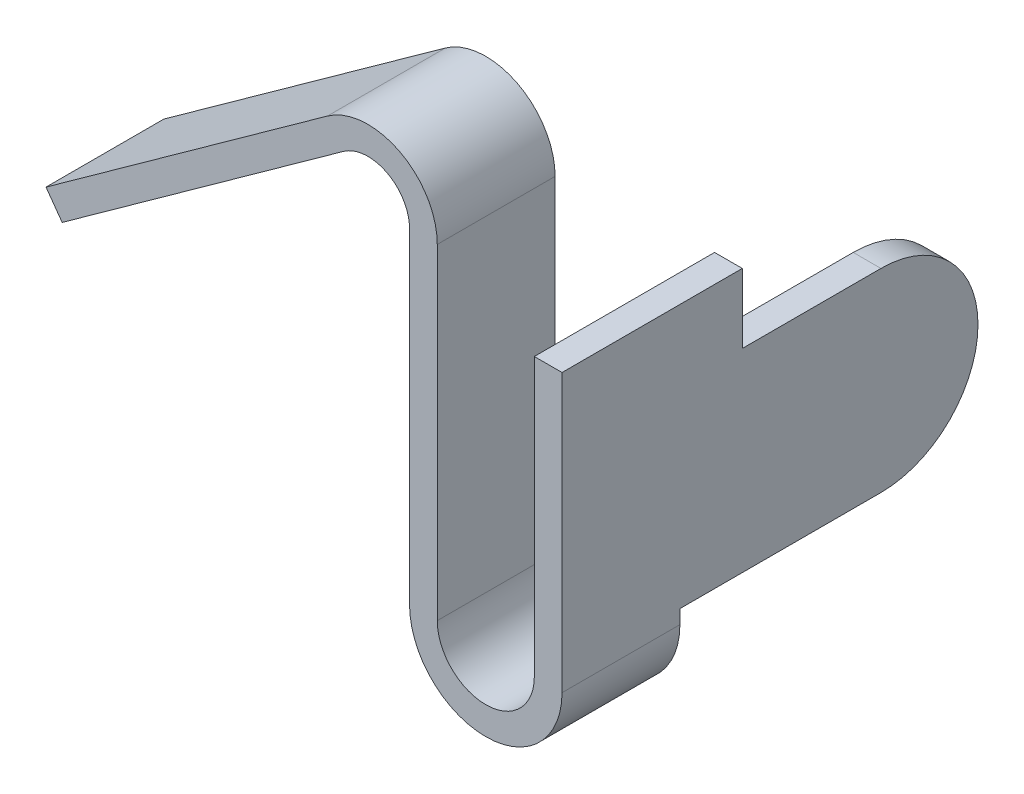
ISO-10303-21;
HEADER;
FILE_DESCRIPTION(('STEP AP214'),'2;1');
FILE_NAME('part.step','',(''),(''),'','','');
FILE_SCHEMA(('AUTOMOTIVE_DESIGN { 1 0 10303 214 1 1 1 1 }'));
ENDSEC;
DATA;
#1=APPLICATION_CONTEXT('core data for automotive mechanical design processes');
#2=APPLICATION_PROTOCOL_DEFINITION('international standard','automotive_design',2000,#1);
#3=PRODUCT_CONTEXT('',#1,'mechanical');
#4=PRODUCT('Part','Part','',(#3));
#5=PRODUCT_RELATED_PRODUCT_CATEGORY('part','',(#4));
#6=PRODUCT_DEFINITION_FORMATION('','',#4);
#7=PRODUCT_DEFINITION_CONTEXT('part definition',#1,'design');
#8=PRODUCT_DEFINITION('design','',#6,#7);
#9=PRODUCT_DEFINITION_SHAPE('','',#8);
#10=(LENGTH_UNIT() NAMED_UNIT(*) SI_UNIT(.MILLI.,.METRE.));
#11=(NAMED_UNIT(*) PLANE_ANGLE_UNIT() SI_UNIT($,.RADIAN.));
#12=(NAMED_UNIT(*) SI_UNIT($,.STERADIAN.) SOLID_ANGLE_UNIT());
#13=UNCERTAINTY_MEASURE_WITH_UNIT(LENGTH_MEASURE(1.E-05),#10,'distance_accuracy_value','');
#14=(GEOMETRIC_REPRESENTATION_CONTEXT(3) GLOBAL_UNCERTAINTY_ASSIGNED_CONTEXT((#13)) GLOBAL_UNIT_ASSIGNED_CONTEXT((#10,
#11,#12)) REPRESENTATION_CONTEXT('',''));
#15=CARTESIAN_POINT('',(0.,0.,0.));
#16=DIRECTION('',(0.,0.,1.));
#17=DIRECTION('',(1.,0.,0.));
#18=AXIS2_PLACEMENT_3D('',#15,#16,#17);
#19=CARTESIAN_POINT('',(0.,-0.7,-0.7));
#20=DIRECTION('',(0.,-1.,0.));
#21=DIRECTION('',(0.,0.,-1.));
#22=AXIS2_PLACEMENT_3D('',#19,#20,#21);
#23=PLANE('',#22);
#24=DIRECTION('',(0.,0.,1.));
#25=VECTOR('',#24,1.);
#26=CARTESIAN_POINT('',(2.7,-0.7,-0.7));
#27=LINE('',#26,#25);
#28=CARTESIAN_POINT('',(2.7,-0.7,-1.7));
#29=VERTEX_POINT('',#28);
#30=CARTESIAN_POINT('',(2.7,-0.7,-0.25));
#31=VERTEX_POINT('',#30);
#32=EDGE_CURVE('E221',#29,#31,#27,.T.);
#33=ORIENTED_EDGE('',*,*,#32,.T.);
#34=DIRECTION('',(1.,0.,0.));
#35=VECTOR('',#34,1.);
#36=CARTESIAN_POINT('',(0.,-0.7,-0.25));
#37=LINE('',#36,#35);
#38=CARTESIAN_POINT('',(2.5,-0.7,-0.25));
#39=VERTEX_POINT('',#38);
#40=EDGE_CURVE('E183',#39,#31,#37,.T.);
#41=ORIENTED_EDGE('',*,*,#40,.F.);
#42=DIRECTION('',(0.,0.,1.));
#43=VECTOR('',#42,1.);
#44=CARTESIAN_POINT('',(2.5,-0.7,-0.7));
#45=LINE('',#44,#43);
#46=CARTESIAN_POINT('',(2.5,-0.7,-1.7));
#47=VERTEX_POINT('',#46);
#48=EDGE_CURVE('E220',#47,#39,#45,.T.);
#49=ORIENTED_EDGE('',*,*,#48,.F.);
#50=DIRECTION('',(1.,0.,0.));
#51=VECTOR('',#50,1.);
#52=CARTESIAN_POINT('',(2.7,-0.7,-1.7));
#53=LINE('',#52,#51);
#54=EDGE_CURVE('E11',#47,#29,#53,.T.);
#55=ORIENTED_EDGE('',*,*,#54,.T.);
#56=EDGE_LOOP('',(#33,#41,#49,#55));
#57=FACE_BOUND('',#56,.T.);
#58=ADVANCED_FACE('F34',(#57),#23,.T.);
#59=CARTESIAN_POINT('',(0.,0.,-0.7));
#60=DIRECTION('',(0.,0.,1.));
#61=DIRECTION('',(1.,0.,0.));
#62=AXIS2_PLACEMENT_3D('',#59,#60,#61);
#63=PLANE('',#62);
#64=DIRECTION('',(1.,0.,0.));
#65=VECTOR('',#64,1.);
#66=CARTESIAN_POINT('',(0.,0.7,-0.7));
#67=LINE('',#66,#65);
#68=CARTESIAN_POINT('',(2.5,0.7,-0.7));
#69=VERTEX_POINT('',#68);
#70=CARTESIAN_POINT('',(2.7,0.7,-0.7));
#71=VERTEX_POINT('',#70);
#72=EDGE_CURVE('E205',#69,#71,#67,.T.);
#73=ORIENTED_EDGE('',*,*,#72,.F.);
#74=DIRECTION('',(0.,1.,0.));
#75=VECTOR('',#74,1.);
#76=CARTESIAN_POINT('',(2.5,0.,-0.7));
#77=LINE('',#76,#75);
#78=CARTESIAN_POINT('',(2.5,1.2,-0.7));
#79=VERTEX_POINT('',#78);
#80=EDGE_CURVE('E212',#69,#79,#77,.T.);
#81=ORIENTED_EDGE('',*,*,#80,.T.);
#82=DIRECTION('',(1.,0.,0.));
#83=VECTOR('',#82,1.);
#84=CARTESIAN_POINT('',(0.,1.2,-0.7));
#85=LINE('',#84,#83);
#86=CARTESIAN_POINT('',(2.7,1.2,-0.7));
#87=VERTEX_POINT('',#86);
#88=EDGE_CURVE('E217',#79,#87,#85,.T.);
#89=ORIENTED_EDGE('',*,*,#88,.T.);
#90=DIRECTION('',(0.,-1.,0.));
#91=VECTOR('',#90,1.);
#92=CARTESIAN_POINT('',(2.7,0.,-0.7));
#93=LINE('',#92,#91);
#94=EDGE_CURVE('E214',#87,#71,#93,.T.);
#95=ORIENTED_EDGE('',*,*,#94,.T.);
#96=EDGE_LOOP('',(#73,#81,#89,#95));
#97=FACE_BOUND('',#96,.T.);
#98=ADVANCED_FACE('F303',(#97),#63,.F.);
#99=CARTESIAN_POINT('',(1.6,0.,0.6));
#100=DIRECTION('',(1.,0.,0.));
#101=DIRECTION('',(0.,0.,-1.));
#102=AXIS2_PLACEMENT_3D('',#99,#100,#101);
#103=PLANE('',#102);
#104=DIRECTION('',(0.,0.,-1.));
#105=VECTOR('',#104,1.);
#106=CARTESIAN_POINT('',(1.6,1.55,0.6));
#107=LINE('',#106,#105);
#108=CARTESIAN_POINT('',(1.6,1.55,0.6));
#109=VERTEX_POINT('',#108);
#110=CARTESIAN_POINT('',(1.6,1.55,-0.25));
#111=VERTEX_POINT('',#110);
#112=EDGE_CURVE('E179',#109,#111,#107,.T.);
#113=ORIENTED_EDGE('',*,*,#112,.T.);
#114=DIRECTION('',(0.,-1.,0.));
#115=VECTOR('',#114,1.);
#116=CARTESIAN_POINT('',(1.6,0.,-0.25));
#117=LINE('',#116,#115);
#118=CARTESIAN_POINT('',(1.6,-0.8,-0.25));
#119=VERTEX_POINT('',#118);
#120=EDGE_CURVE('E172',#111,#119,#117,.T.);
#121=ORIENTED_EDGE('',*,*,#120,.T.);
#122=DIRECTION('',(0.,0.,-1.));
#123=VECTOR('',#122,1.);
#124=CARTESIAN_POINT('',(1.6,-0.8,0.6));
#125=LINE('',#124,#123);
#126=CARTESIAN_POINT('',(1.6,-0.8,0.6));
#127=VERTEX_POINT('',#126);
#128=EDGE_CURVE('E155',#127,#119,#125,.T.);
#129=ORIENTED_EDGE('',*,*,#128,.F.);
#130=DIRECTION('',(0.,-1.,0.));
#131=VECTOR('',#130,1.);
#132=CARTESIAN_POINT('',(1.6,0.,0.6));
#133=LINE('',#132,#131);
#134=EDGE_CURVE('E224',#109,#127,#133,.T.);
#135=ORIENTED_EDGE('',*,*,#134,.F.);
#136=EDGE_LOOP('',(#113,#121,#129,#135));
#137=FACE_BOUND('',#136,.T.);
#138=ADVANCED_FACE('F177',(#137),#103,.F.);
#139=CARTESIAN_POINT('',(2.15,-0.8,0.6));
#140=DIRECTION('',(0.,0.,-1.));
#141=DIRECTION('',(-1.,0.,0.));
#142=AXIS2_PLACEMENT_3D('',#139,#140,#141);
#143=CYLINDRICAL_SURFACE('',#142,0.55);
#144=ORIENTED_EDGE('',*,*,#128,.T.);
#145=CARTESIAN_POINT('',(2.15,-0.8,-0.25));
#146=DIRECTION('',(0.,0.,1.));
#147=DIRECTION('',(1.,0.,0.));
#148=AXIS2_PLACEMENT_3D('',#145,#146,#147);
#149=CIRCLE('',#148,0.55);
#150=CARTESIAN_POINT('',(2.7,-0.8,-0.25));
#151=VERTEX_POINT('',#150);
#152=EDGE_CURVE('E159',#119,#151,#149,.T.);
#153=ORIENTED_EDGE('',*,*,#152,.T.);
#154=DIRECTION('',(0.,0.,-1.));
#155=VECTOR('',#154,1.);
#156=CARTESIAN_POINT('',(2.7,-0.8,0.6));
#157=LINE('',#156,#155);
#158=CARTESIAN_POINT('',(2.7,-0.8,0.6));
#159=VERTEX_POINT('',#158);
#160=EDGE_CURVE('E166',#159,#151,#157,.T.);
#161=ORIENTED_EDGE('',*,*,#160,.F.);
#162=CARTESIAN_POINT('',(2.15,-0.8,0.6));
#163=DIRECTION('',(0.,0.,1.));
#164=DIRECTION('',(1.,0.,0.));
#165=AXIS2_PLACEMENT_3D('',#162,#163,#164);
#166=CIRCLE('',#165,0.55);
#167=EDGE_CURVE('E160',#127,#159,#166,.T.);
#168=ORIENTED_EDGE('',*,*,#167,.F.);
#169=EDGE_LOOP('',(#144,#153,#161,#168));
#170=FACE_BOUND('',#169,.T.);
#171=ADVANCED_FACE('F157',(#170),#143,.T.);
#172=CARTESIAN_POINT('',(2.7,0.,0.6));
#173=DIRECTION('',(-1.,0.,0.));
#174=DIRECTION('',(0.,-1.,0.));
#175=AXIS2_PLACEMENT_3D('',#172,#173,#174);
#176=PLANE('',#175);
#177=CARTESIAN_POINT('',(2.7,0.,-1.7));
#178=DIRECTION('',(-1.,0.,0.));
#179=DIRECTION('',(0.,-1.,0.));
#180=AXIS2_PLACEMENT_3D('',#177,#178,#179);
#181=CIRCLE('',#180,0.7);
#182=CARTESIAN_POINT('',(2.7,0.,-2.4));
#183=VERTEX_POINT('',#182);
#184=EDGE_CURVE('E165',#29,#183,#181,.F.);
#185=ORIENTED_EDGE('',*,*,#184,.T.);
#186=CARTESIAN_POINT('',(2.7,0.,-1.7));
#187=DIRECTION('',(-1.,0.,0.));
#188=DIRECTION('',(0.,-1.,0.));
#189=AXIS2_PLACEMENT_3D('',#186,#187,#188);
#190=CIRCLE('',#189,0.7);
#191=CARTESIAN_POINT('',(2.7,0.7,-1.7));
#192=VERTEX_POINT('',#191);
#193=EDGE_CURVE('E276',#183,#192,#190,.F.);
#194=ORIENTED_EDGE('',*,*,#193,.T.);
#195=DIRECTION('',(0.,0.,1.));
#196=VECTOR('',#195,1.);
#197=CARTESIAN_POINT('',(2.7,0.7,-2.4));
#198=LINE('',#197,#196);
#199=EDGE_CURVE('E208',#192,#71,#198,.T.);
#200=ORIENTED_EDGE('',*,*,#199,.T.);
#201=ORIENTED_EDGE('',*,*,#94,.F.);
#202=DIRECTION('',(0.,0.,-1.));
#203=VECTOR('',#202,1.);
#204=CARTESIAN_POINT('',(2.7,1.2,0.6));
#205=LINE('',#204,#203);
#206=CARTESIAN_POINT('',(2.7,1.2,0.6));
#207=VERTEX_POINT('',#206);
#208=EDGE_CURVE('E272',#207,#87,#205,.T.);
#209=ORIENTED_EDGE('',*,*,#208,.F.);
#210=DIRECTION('',(0.,1.,0.));
#211=VECTOR('',#210,1.);
#212=CARTESIAN_POINT('',(2.7,0.,0.6));
#213=LINE('',#212,#211);
#214=EDGE_CURVE('E228',#159,#207,#213,.T.);
#215=ORIENTED_EDGE('',*,*,#214,.F.);
#216=ORIENTED_EDGE('',*,*,#160,.T.);
#217=DIRECTION('',(0.,1.,0.));
#218=VECTOR('',#217,1.);
#219=CARTESIAN_POINT('',(2.7,0.,-0.25));
#220=LINE('',#219,#218);
#221=EDGE_CURVE('E175',#151,#31,#220,.T.);
#222=ORIENTED_EDGE('',*,*,#221,.T.);
#223=ORIENTED_EDGE('',*,*,#32,.F.);
#224=EDGE_LOOP('',(#185,#194,#200,#201,#209,#215,#216,#222,#223));
#225=FACE_BOUND('',#224,.T.);
#226=ADVANCED_FACE('F296',(#225),#176,.F.);
#227=CARTESIAN_POINT('',(0.,1.2,0.6));
#228=DIRECTION('',(0.,1.,0.));
#229=DIRECTION('',(0.,0.,1.));
#230=AXIS2_PLACEMENT_3D('',#227,#228,#229);
#231=PLANE('',#230);
#232=ORIENTED_EDGE('',*,*,#208,.T.);
#233=ORIENTED_EDGE('',*,*,#88,.F.);
#234=DIRECTION('',(0.,0.,-1.));
#235=VECTOR('',#234,1.);
#236=CARTESIAN_POINT('',(2.5,1.2,0.6));
#237=LINE('',#236,#235);
#238=CARTESIAN_POINT('',(2.5,1.2,0.6));
#239=VERTEX_POINT('',#238);
#240=EDGE_CURVE('E269',#239,#79,#237,.T.);
#241=ORIENTED_EDGE('',*,*,#240,.F.);
#242=DIRECTION('',(1.,0.,0.));
#243=VECTOR('',#242,1.);
#244=CARTESIAN_POINT('',(0.,1.2,0.6));
#245=LINE('',#244,#243);
#246=EDGE_CURVE('E230',#239,#207,#245,.T.);
#247=ORIENTED_EDGE('',*,*,#246,.T.);
#248=EDGE_LOOP('',(#232,#233,#241,#247));
#249=FACE_BOUND('',#248,.T.);
#250=ADVANCED_FACE('F308',(#249),#231,.T.);
#251=CARTESIAN_POINT('',(2.5,0.,0.6));
#252=DIRECTION('',(-1.,0.,0.));
#253=DIRECTION('',(0.,0.,1.));
#254=AXIS2_PLACEMENT_3D('',#251,#252,#253);
#255=PLANE('',#254);
#256=DIRECTION('',(0.,0.,1.));
#257=VECTOR('',#256,1.);
#258=CARTESIAN_POINT('',(2.5,0.7,-2.4));
#259=LINE('',#258,#257);
#260=CARTESIAN_POINT('',(2.5,0.7,-1.7));
#261=VERTEX_POINT('',#260);
#262=EDGE_CURVE('E210',#261,#69,#259,.T.);
#263=ORIENTED_EDGE('',*,*,#262,.F.);
#264=CARTESIAN_POINT('',(2.5,0.,-1.7));
#265=DIRECTION('',(-1.,0.,0.));
#266=DIRECTION('',(0.,0.,1.));
#267=AXIS2_PLACEMENT_3D('',#264,#265,#266);
#268=CIRCLE('',#267,0.7);
#269=CARTESIAN_POINT('',(2.5,0.,-2.4));
#270=VERTEX_POINT('',#269);
#271=EDGE_CURVE('E43',#261,#270,#268,.T.);
#272=ORIENTED_EDGE('',*,*,#271,.T.);
#273=CARTESIAN_POINT('',(2.5,0.,-1.7));
#274=DIRECTION('',(-1.,0.,0.));
#275=DIRECTION('',(0.,0.,1.));
#276=AXIS2_PLACEMENT_3D('',#273,#274,#275);
#277=CIRCLE('',#276,0.7);
#278=EDGE_CURVE('E58',#270,#47,#277,.T.);
#279=ORIENTED_EDGE('',*,*,#278,.T.);
#280=ORIENTED_EDGE('',*,*,#48,.T.);
#281=DIRECTION('',(0.,1.,0.));
#282=VECTOR('',#281,1.);
#283=CARTESIAN_POINT('',(2.5,0.,-0.25));
#284=LINE('',#283,#282);
#285=CARTESIAN_POINT('',(2.5,-0.8,-0.25));
#286=VERTEX_POINT('',#285);
#287=EDGE_CURVE('E50',#286,#39,#284,.T.);
#288=ORIENTED_EDGE('',*,*,#287,.F.);
#289=DIRECTION('',(0.,0.,-1.));
#290=VECTOR('',#289,1.);
#291=CARTESIAN_POINT('',(2.5,-0.8,0.6));
#292=LINE('',#291,#290);
#293=CARTESIAN_POINT('',(2.5,-0.8,0.6));
#294=VERTEX_POINT('',#293);
#295=EDGE_CURVE('E267',#294,#286,#292,.T.);
#296=ORIENTED_EDGE('',*,*,#295,.F.);
#297=DIRECTION('',(0.,1.,0.));
#298=VECTOR('',#297,1.);
#299=CARTESIAN_POINT('',(2.5,0.,0.6));
#300=LINE('',#299,#298);
#301=EDGE_CURVE('E233',#294,#239,#300,.T.);
#302=ORIENTED_EDGE('',*,*,#301,.T.);
#303=ORIENTED_EDGE('',*,*,#240,.T.);
#304=ORIENTED_EDGE('',*,*,#80,.F.);
#305=EDGE_LOOP('',(#263,#272,#279,#280,#288,#296,#302,#303,#304));
#306=FACE_BOUND('',#305,.T.);
#307=ADVANCED_FACE('F283',(#306),#255,.T.);
#308=CARTESIAN_POINT('',(2.15,-0.8,0.6));
#309=DIRECTION('',(0.,0.,-1.));
#310=DIRECTION('',(-1.,0.,0.));
#311=AXIS2_PLACEMENT_3D('',#308,#309,#310);
#312=CYLINDRICAL_SURFACE('',#311,0.35);
#313=ORIENTED_EDGE('',*,*,#295,.T.);
#314=CARTESIAN_POINT('',(2.15,-0.8,-0.25));
#315=DIRECTION('',(0.,0.,1.));
#316=DIRECTION('',(1.,0.,0.));
#317=AXIS2_PLACEMENT_3D('',#314,#315,#316);
#318=CIRCLE('',#317,0.35);
#319=CARTESIAN_POINT('',(1.8,-0.8,-0.25));
#320=VERTEX_POINT('',#319);
#321=EDGE_CURVE('E186',#320,#286,#318,.T.);
#322=ORIENTED_EDGE('',*,*,#321,.F.);
#323=DIRECTION('',(0.,0.,-1.));
#324=VECTOR('',#323,1.);
#325=CARTESIAN_POINT('',(1.8,-0.8,0.6));
#326=LINE('',#325,#324);
#327=CARTESIAN_POINT('',(1.8,-0.8,0.6));
#328=VERTEX_POINT('',#327);
#329=EDGE_CURVE('E265',#328,#320,#326,.T.);
#330=ORIENTED_EDGE('',*,*,#329,.F.);
#331=CARTESIAN_POINT('',(2.15,-0.8,0.6));
#332=DIRECTION('',(0.,0.,1.));
#333=DIRECTION('',(1.,0.,0.));
#334=AXIS2_PLACEMENT_3D('',#331,#332,#333);
#335=CIRCLE('',#334,0.35);
#336=EDGE_CURVE('E236',#328,#294,#335,.T.);
#337=ORIENTED_EDGE('',*,*,#336,.T.);
#338=EDGE_LOOP('',(#313,#322,#330,#337));
#339=FACE_BOUND('',#338,.T.);
#340=ADVANCED_FACE('F317',(#339),#312,.F.);
#341=CARTESIAN_POINT('',(1.8,0.,0.6));
#342=DIRECTION('',(1.,0.,0.));
#343=DIRECTION('',(0.,1.,0.));
#344=AXIS2_PLACEMENT_3D('',#341,#342,#343);
#345=PLANE('',#344);
#346=ORIENTED_EDGE('',*,*,#329,.T.);
#347=DIRECTION('',(0.,-1.,0.));
#348=VECTOR('',#347,1.);
#349=CARTESIAN_POINT('',(1.8,0.,-0.25));
#350=LINE('',#349,#348);
#351=CARTESIAN_POINT('',(1.8,1.55,-0.25));
#352=VERTEX_POINT('',#351);
#353=EDGE_CURVE('E188',#352,#320,#350,.T.);
#354=ORIENTED_EDGE('',*,*,#353,.F.);
#355=DIRECTION('',(0.,0.,-1.));
#356=VECTOR('',#355,1.);
#357=CARTESIAN_POINT('',(1.8,1.55,0.6));
#358=LINE('',#357,#356);
#359=CARTESIAN_POINT('',(1.8,1.55,0.6));
#360=VERTEX_POINT('',#359);
#361=EDGE_CURVE('E263',#360,#352,#358,.T.);
#362=ORIENTED_EDGE('',*,*,#361,.F.);
#363=DIRECTION('',(0.,-1.,0.));
#364=VECTOR('',#363,1.);
#365=CARTESIAN_POINT('',(1.8,0.,0.6));
#366=LINE('',#365,#364);
#367=EDGE_CURVE('E239',#360,#328,#366,.T.);
#368=ORIENTED_EDGE('',*,*,#367,.T.);
#369=EDGE_LOOP('',(#346,#354,#362,#368));
#370=FACE_BOUND('',#369,.T.);
#371=ADVANCED_FACE('F321',(#370),#345,.T.);
#372=CARTESIAN_POINT('',(1.3,1.55,0.6));
#373=DIRECTION('',(0.,0.,-1.));
#374=DIRECTION('',(-1.,0.,0.));
#375=AXIS2_PLACEMENT_3D('',#372,#373,#374);
#376=CYLINDRICAL_SURFACE('',#375,0.5);
#377=ORIENTED_EDGE('',*,*,#361,.T.);
#378=CARTESIAN_POINT('',(1.3,1.55,-0.25));
#379=DIRECTION('',(0.,0.,1.));
#380=DIRECTION('',(1.,0.,0.));
#381=AXIS2_PLACEMENT_3D('',#378,#379,#380);
#382=CIRCLE('',#381,0.5);
#383=CARTESIAN_POINT('',(1.00820331747019,1.95602302405726,-0.25));
#384=VERTEX_POINT('',#383);
#385=EDGE_CURVE('E191',#384,#352,#382,.F.);
#386=ORIENTED_EDGE('',*,*,#385,.F.);
#387=DIRECTION('',(0.,0.,-1.));
#388=VECTOR('',#387,1.);
#389=CARTESIAN_POINT('',(1.00820331747019,1.95602302405726,0.6));
#390=LINE('',#389,#388);
#391=CARTESIAN_POINT('',(1.00820331747019,1.95602302405726,0.6));
#392=VERTEX_POINT('',#391);
#393=EDGE_CURVE('E261',#392,#384,#390,.T.);
#394=ORIENTED_EDGE('',*,*,#393,.F.);
#395=CARTESIAN_POINT('',(1.3,1.55,0.6));
#396=DIRECTION('',(0.,0.,1.));
#397=DIRECTION('',(1.,0.,0.));
#398=AXIS2_PLACEMENT_3D('',#395,#396,#397);
#399=CIRCLE('',#398,0.5);
#400=EDGE_CURVE('E242',#392,#360,#399,.F.);
#401=ORIENTED_EDGE('',*,*,#400,.T.);
#402=EDGE_LOOP('',(#377,#386,#394,#401));
#403=FACE_BOUND('',#402,.T.);
#404=ADVANCED_FACE('F326',(#403),#376,.T.);
#405=CARTESIAN_POINT('',(-0.583593365059612,0.812046048114513,0.6));
#406=DIRECTION('',(-0.583593365059612,0.812046048114513,0.));
#407=DIRECTION('',(-0.812046048114513,-0.583593365059612,0.));
#408=AXIS2_PLACEMENT_3D('',#405,#406,#407);
#409=PLANE('',#408);
#410=ORIENTED_EDGE('',*,*,#393,.T.);
#411=DIRECTION('',(0.812046048114513,0.583593365059612,0.));
#412=VECTOR('',#411,1.);
#413=CARTESIAN_POINT('',(-0.583593365059612,0.812046048114513,-0.25));
#414=LINE('',#413,#412);
#415=CARTESIAN_POINT('',(-1.02191180281609,0.497039611408226,-0.25));
#416=VERTEX_POINT('',#415);
#417=EDGE_CURVE('E194',#416,#384,#414,.T.);
#418=ORIENTED_EDGE('',*,*,#417,.F.);
#419=DIRECTION('',(0.,0.,-1.));
#420=VECTOR('',#419,1.);
#421=CARTESIAN_POINT('',(-1.02191180281609,0.497039611408226,0.6));
#422=LINE('',#421,#420);
#423=CARTESIAN_POINT('',(-1.02191180281609,0.497039611408226,0.6));
#424=VERTEX_POINT('',#423);
#425=EDGE_CURVE('E259',#424,#416,#422,.T.);
#426=ORIENTED_EDGE('',*,*,#425,.F.);
#427=DIRECTION('',(0.812046048114513,0.583593365059612,0.));
#428=VECTOR('',#427,1.);
#429=CARTESIAN_POINT('',(-0.583593365059612,0.812046048114513,0.6));
#430=LINE('',#429,#428);
#431=EDGE_CURVE('E245',#424,#392,#430,.T.);
#432=ORIENTED_EDGE('',*,*,#431,.T.);
#433=EDGE_LOOP('',(#410,#418,#426,#432));
#434=FACE_BOUND('',#433,.T.);
#435=ADVANCED_FACE('F329',(#434),#409,.T.);
#436=CARTESIAN_POINT('',(-0.438318437756473,-0.315006436706286,0.6));
#437=DIRECTION('',(0.812046048114511,0.583593365059615,0.));
#438=DIRECTION('',(-0.583593365059615,0.812046048114511,0.));
#439=AXIS2_PLACEMENT_3D('',#436,#437,#438);
#440=PLANE('',#439);
#441=ORIENTED_EDGE('',*,*,#425,.T.);
#442=DIRECTION('',(0.583593365059615,-0.812046048114511,0.));
#443=VECTOR('',#442,1.);
#444=CARTESIAN_POINT('',(-0.438318437756473,-0.315006436706286,-0.25));
#445=LINE('',#444,#443);
#446=CARTESIAN_POINT('',(-0.905193129804166,0.334630401785324,-0.25));
#447=VERTEX_POINT('',#446);
#448=EDGE_CURVE('E197',#416,#447,#445,.T.);
#449=ORIENTED_EDGE('',*,*,#448,.T.);
#450=DIRECTION('',(0.,0.,-1.));
#451=VECTOR('',#450,1.);
#452=CARTESIAN_POINT('',(-0.905193129804166,0.334630401785324,0.6));
#453=LINE('',#452,#451);
#454=CARTESIAN_POINT('',(-0.905193129804166,0.334630401785324,0.6));
#455=VERTEX_POINT('',#454);
#456=EDGE_CURVE('E257',#455,#447,#453,.T.);
#457=ORIENTED_EDGE('',*,*,#456,.F.);
#458=DIRECTION('',(0.583593365059615,-0.812046048114511,0.));
#459=VECTOR('',#458,1.);
#460=CARTESIAN_POINT('',(-0.438318437756473,-0.315006436706286,0.6));
#461=LINE('',#460,#459);
#462=EDGE_CURVE('E248',#424,#455,#461,.T.);
#463=ORIENTED_EDGE('',*,*,#462,.F.);
#464=EDGE_LOOP('',(#441,#449,#457,#463));
#465=FACE_BOUND('',#464,.T.);
#466=ADVANCED_FACE('F334',(#465),#440,.F.);
#467=CARTESIAN_POINT('',(-0.46687469204769,0.649636838491611,0.6));
#468=DIRECTION('',(-0.583593365059612,0.812046048114513,0.));
#469=DIRECTION('',(-0.812046048114513,-0.583593365059612,0.));
#470=AXIS2_PLACEMENT_3D('',#467,#468,#469);
#471=PLANE('',#470);
#472=ORIENTED_EDGE('',*,*,#456,.T.);
#473=DIRECTION('',(0.812046048114513,0.583593365059612,0.));
#474=VECTOR('',#473,1.);
#475=CARTESIAN_POINT('',(-0.46687469204769,0.649636838491611,-0.25));
#476=LINE('',#475,#474);
#477=CARTESIAN_POINT('',(1.12492199048212,1.79361381443435,-0.25));
#478=VERTEX_POINT('',#477);
#479=EDGE_CURVE('E200',#447,#478,#476,.T.);
#480=ORIENTED_EDGE('',*,*,#479,.T.);
#481=DIRECTION('',(0.,0.,-1.));
#482=VECTOR('',#481,1.);
#483=CARTESIAN_POINT('',(1.12492199048212,1.79361381443435,0.6));
#484=LINE('',#483,#482);
#485=CARTESIAN_POINT('',(1.12492199048212,1.79361381443435,0.6));
#486=VERTEX_POINT('',#485);
#487=EDGE_CURVE('E255',#486,#478,#484,.T.);
#488=ORIENTED_EDGE('',*,*,#487,.F.);
#489=DIRECTION('',(0.812046048114513,0.583593365059612,0.));
#490=VECTOR('',#489,1.);
#491=CARTESIAN_POINT('',(-0.46687469204769,0.649636838491611,0.6));
#492=LINE('',#491,#490);
#493=EDGE_CURVE('E250',#455,#486,#492,.T.);
#494=ORIENTED_EDGE('',*,*,#493,.F.);
#495=EDGE_LOOP('',(#472,#480,#488,#494));
#496=FACE_BOUND('',#495,.T.);
#497=ADVANCED_FACE('F340',(#496),#471,.F.);
#498=CARTESIAN_POINT('',(1.3,1.55,0.6));
#499=DIRECTION('',(0.,0.,-1.));
#500=DIRECTION('',(-1.,0.,0.));
#501=AXIS2_PLACEMENT_3D('',#498,#499,#500);
#502=CYLINDRICAL_SURFACE('',#501,0.3);
#503=ORIENTED_EDGE('',*,*,#487,.T.);
#504=CARTESIAN_POINT('',(1.3,1.55,-0.25));
#505=DIRECTION('',(0.,0.,1.));
#506=DIRECTION('',(1.,0.,0.));
#507=AXIS2_PLACEMENT_3D('',#504,#505,#506);
#508=CIRCLE('',#507,0.3);
#509=EDGE_CURVE('E203',#478,#111,#508,.F.);
#510=ORIENTED_EDGE('',*,*,#509,.T.);
#511=ORIENTED_EDGE('',*,*,#112,.F.);
#512=CARTESIAN_POINT('',(1.3,1.55,0.6));
#513=DIRECTION('',(0.,0.,1.));
#514=DIRECTION('',(1.,0.,0.));
#515=AXIS2_PLACEMENT_3D('',#512,#513,#514);
#516=CIRCLE('',#515,0.3);
#517=EDGE_CURVE('E252',#486,#109,#516,.F.);
#518=ORIENTED_EDGE('',*,*,#517,.F.);
#519=EDGE_LOOP('',(#503,#510,#511,#518));
#520=FACE_BOUND('',#519,.T.);
#521=ADVANCED_FACE('F342',(#520),#502,.F.);
#522=CARTESIAN_POINT('',(0.,0.,0.6));
#523=DIRECTION('',(0.,0.,1.));
#524=DIRECTION('',(1.,0.,0.));
#525=AXIS2_PLACEMENT_3D('',#522,#523,#524);
#526=PLANE('',#525);
#527=ORIENTED_EDGE('',*,*,#134,.T.);
#528=ORIENTED_EDGE('',*,*,#167,.T.);
#529=ORIENTED_EDGE('',*,*,#214,.T.);
#530=ORIENTED_EDGE('',*,*,#246,.F.);
#531=ORIENTED_EDGE('',*,*,#301,.F.);
#532=ORIENTED_EDGE('',*,*,#336,.F.);
#533=ORIENTED_EDGE('',*,*,#367,.F.);
#534=ORIENTED_EDGE('',*,*,#400,.F.);
#535=ORIENTED_EDGE('',*,*,#431,.F.);
#536=ORIENTED_EDGE('',*,*,#462,.T.);
#537=ORIENTED_EDGE('',*,*,#493,.T.);
#538=ORIENTED_EDGE('',*,*,#517,.T.);
#539=EDGE_LOOP('',(#527,#528,#529,#530,#531,#532,#533,#534,#535,#536,#537,#538));
#540=FACE_BOUND('',#539,.T.);
#541=ADVANCED_FACE('F312',(#540),#526,.T.);
#542=CARTESIAN_POINT('',(0.,0.7,-2.4));
#543=DIRECTION('',(0.,-1.,0.));
#544=DIRECTION('',(0.,0.,-1.));
#545=AXIS2_PLACEMENT_3D('',#542,#543,#544);
#546=PLANE('',#545);
#547=ORIENTED_EDGE('',*,*,#199,.F.);
#548=DIRECTION('',(1.,0.,0.));
#549=VECTOR('',#548,1.);
#550=CARTESIAN_POINT('',(0.,0.7,-1.7));
#551=LINE('',#550,#549);
#552=EDGE_CURVE('E278',#192,#261,#551,.F.);
#553=ORIENTED_EDGE('',*,*,#552,.T.);
#554=ORIENTED_EDGE('',*,*,#262,.T.);
#555=ORIENTED_EDGE('',*,*,#72,.T.);
#556=EDGE_LOOP('',(#547,#553,#554,#555));
#557=FACE_BOUND('',#556,.T.);
#558=ADVANCED_FACE('F300',(#557),#546,.F.);
#559=CARTESIAN_POINT('',(0.,0.,-1.7));
#560=DIRECTION('',(-1.,0.,0.));
#561=DIRECTION('',(0.,0.,1.));
#562=AXIS2_PLACEMENT_3D('',#559,#560,#561);
#563=CYLINDRICAL_SURFACE('',#562,0.7);
#564=ORIENTED_EDGE('',*,*,#54,.F.);
#565=ORIENTED_EDGE('',*,*,#278,.F.);
#566=DIRECTION('',(1.,0.,0.));
#567=VECTOR('',#566,1.);
#568=CARTESIAN_POINT('',(2.5,0.,-2.4));
#569=LINE('',#568,#567);
#570=EDGE_CURVE('E38',#183,#270,#569,.F.);
#571=ORIENTED_EDGE('',*,*,#570,.F.);
#572=ORIENTED_EDGE('',*,*,#184,.F.);
#573=EDGE_LOOP('',(#564,#565,#571,#572));
#574=FACE_BOUND('',#573,.T.);
#575=ADVANCED_FACE('F36',(#574),#563,.T.);
#576=CARTESIAN_POINT('',(0.,0.,-1.7));
#577=DIRECTION('',(1.,0.,0.));
#578=DIRECTION('',(0.,0.,-1.));
#579=AXIS2_PLACEMENT_3D('',#576,#577,#578);
#580=CYLINDRICAL_SURFACE('',#579,0.7);
#581=ORIENTED_EDGE('',*,*,#271,.F.);
#582=ORIENTED_EDGE('',*,*,#552,.F.);
#583=ORIENTED_EDGE('',*,*,#193,.F.);
#584=ORIENTED_EDGE('',*,*,#570,.T.);
#585=EDGE_LOOP('',(#581,#582,#583,#584));
#586=FACE_BOUND('',#585,.T.);
#587=ADVANCED_FACE('F293',(#586),#580,.T.);
#588=CARTESIAN_POINT('',(0.,0.,-0.25));
#589=DIRECTION('',(0.,0.,1.));
#590=DIRECTION('',(1.,0.,0.));
#591=AXIS2_PLACEMENT_3D('',#588,#589,#590);
#592=PLANE('',#591);
#593=ORIENTED_EDGE('',*,*,#120,.F.);
#594=ORIENTED_EDGE('',*,*,#509,.F.);
#595=ORIENTED_EDGE('',*,*,#479,.F.);
#596=ORIENTED_EDGE('',*,*,#448,.F.);
#597=ORIENTED_EDGE('',*,*,#417,.T.);
#598=ORIENTED_EDGE('',*,*,#385,.T.);
#599=ORIENTED_EDGE('',*,*,#353,.T.);
#600=ORIENTED_EDGE('',*,*,#321,.T.);
#601=ORIENTED_EDGE('',*,*,#287,.T.);
#602=ORIENTED_EDGE('',*,*,#40,.T.);
#603=ORIENTED_EDGE('',*,*,#221,.F.);
#604=ORIENTED_EDGE('',*,*,#152,.F.);
#605=EDGE_LOOP('',(#593,#594,#595,#596,#597,#598,#599,#600,#601,#602,#603,#604));
#606=FACE_BOUND('',#605,.T.);
#607=ADVANCED_FACE('F170',(#606),#592,.F.);
#608=CLOSED_SHELL('',(#58,#98,#138,#171,#226,#250,#307,#340,#371,#404,#435,#466,#497,#521,#541,
#558,#575,#587,#607));
#609=MANIFOLD_SOLID_BREP('B2',#608);
#610=ADVANCED_BREP_SHAPE_REPRESENTATION('',(#18,#609),#14);
#611=SHAPE_DEFINITION_REPRESENTATION(#9,#610);
ENDSEC;
END-ISO-10303-21;
